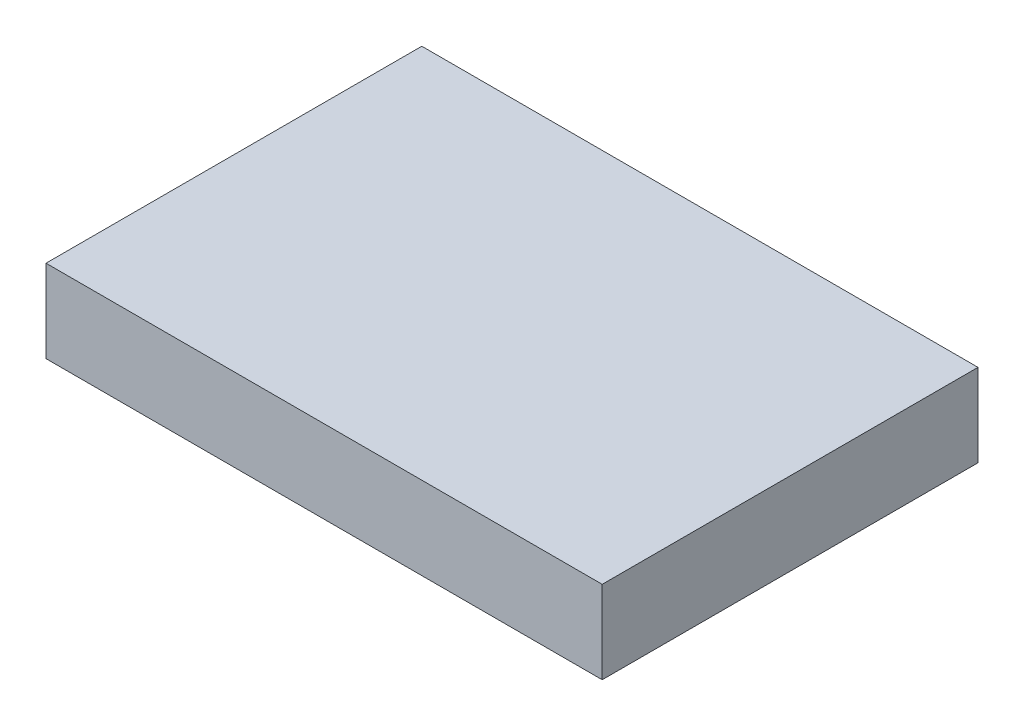
ISO-10303-21;
HEADER;
FILE_DESCRIPTION(('STEP AP214'),'2;1');
FILE_NAME('part.step','',(''),(''),'','','');
FILE_SCHEMA(('AUTOMOTIVE_DESIGN { 1 0 10303 214 1 1 1 1 }'));
ENDSEC;
DATA;
#1=APPLICATION_CONTEXT('core data for automotive mechanical design processes');
#2=APPLICATION_PROTOCOL_DEFINITION('international standard','automotive_design',2000,#1);
#3=PRODUCT_CONTEXT('',#1,'mechanical');
#4=PRODUCT('Part','Part','',(#3));
#5=PRODUCT_RELATED_PRODUCT_CATEGORY('part','',(#4));
#6=PRODUCT_DEFINITION_FORMATION('','',#4);
#7=PRODUCT_DEFINITION_CONTEXT('part definition',#1,'design');
#8=PRODUCT_DEFINITION('design','',#6,#7);
#9=PRODUCT_DEFINITION_SHAPE('','',#8);
#10=(LENGTH_UNIT() NAMED_UNIT(*) SI_UNIT(.MILLI.,.METRE.));
#11=(NAMED_UNIT(*) PLANE_ANGLE_UNIT() SI_UNIT($,.RADIAN.));
#12=(NAMED_UNIT(*) SI_UNIT($,.STERADIAN.) SOLID_ANGLE_UNIT());
#13=UNCERTAINTY_MEASURE_WITH_UNIT(LENGTH_MEASURE(1.E-05),#10,'distance_accuracy_value','');
#14=(GEOMETRIC_REPRESENTATION_CONTEXT(3) GLOBAL_UNCERTAINTY_ASSIGNED_CONTEXT((#13)) GLOBAL_UNIT_ASSIGNED_CONTEXT((#10,
#11,#12)) REPRESENTATION_CONTEXT('',''));
#15=CARTESIAN_POINT('',(0.,0.,0.));
#16=DIRECTION('',(0.,0.,1.));
#17=DIRECTION('',(1.,0.,0.));
#18=AXIS2_PLACEMENT_3D('',#15,#16,#17);
#19=CARTESIAN_POINT('',(18.5,5.5,12.5));
#20=DIRECTION('',(-1.,0.,0.));
#21=DIRECTION('',(0.,0.,1.));
#22=AXIS2_PLACEMENT_3D('',#19,#20,#21);
#23=PLANE('',#22);
#24=DIRECTION('',(0.,0.,-1.));
#25=VECTOR('',#24,1.);
#26=CARTESIAN_POINT('',(18.5,0.,12.5));
#27=LINE('',#26,#25);
#28=CARTESIAN_POINT('',(18.5,0.,12.5));
#29=VERTEX_POINT('',#28);
#30=CARTESIAN_POINT('',(18.5,0.,-12.5));
#31=VERTEX_POINT('',#30);
#32=EDGE_CURVE('E96',#29,#31,#27,.T.);
#33=ORIENTED_EDGE('',*,*,#32,.T.);
#34=DIRECTION('',(0.,-1.,0.));
#35=VECTOR('',#34,1.);
#36=CARTESIAN_POINT('',(18.5,5.5,-12.5));
#37=LINE('',#36,#35);
#38=CARTESIAN_POINT('',(18.5,5.5,-12.5));
#39=VERTEX_POINT('',#38);
#40=EDGE_CURVE('E11',#39,#31,#37,.T.);
#41=ORIENTED_EDGE('',*,*,#40,.F.);
#42=DIRECTION('',(0.,0.,-1.));
#43=VECTOR('',#42,1.);
#44=CARTESIAN_POINT('',(18.5,5.5,12.5));
#45=LINE('',#44,#43);
#46=CARTESIAN_POINT('',(18.5,5.5,12.5));
#47=VERTEX_POINT('',#46);
#48=EDGE_CURVE('E84',#47,#39,#45,.T.);
#49=ORIENTED_EDGE('',*,*,#48,.F.);
#50=DIRECTION('',(0.,-1.,0.));
#51=VECTOR('',#50,1.);
#52=CARTESIAN_POINT('',(18.5,5.5,12.5));
#53=LINE('',#52,#51);
#54=EDGE_CURVE('E92',#47,#29,#53,.T.);
#55=ORIENTED_EDGE('',*,*,#54,.T.);
#56=EDGE_LOOP('',(#33,#41,#49,#55));
#57=FACE_BOUND('',#56,.T.);
#58=ADVANCED_FACE('F33',(#57),#23,.F.);
#59=CARTESIAN_POINT('',(-18.5,5.5,-12.5));
#60=DIRECTION('',(0.,0.,1.));
#61=DIRECTION('',(1.,0.,0.));
#62=AXIS2_PLACEMENT_3D('',#59,#60,#61);
#63=PLANE('',#62);
#64=DIRECTION('',(-1.,0.,0.));
#65=VECTOR('',#64,1.);
#66=CARTESIAN_POINT('',(-18.5,0.,-12.5));
#67=LINE('',#66,#65);
#68=CARTESIAN_POINT('',(-18.5,0.,-12.5));
#69=VERTEX_POINT('',#68);
#70=EDGE_CURVE('E88',#31,#69,#67,.T.);
#71=ORIENTED_EDGE('',*,*,#70,.T.);
#72=DIRECTION('',(0.,-1.,0.));
#73=VECTOR('',#72,1.);
#74=CARTESIAN_POINT('',(-18.5,5.5,-12.5));
#75=LINE('',#74,#73);
#76=CARTESIAN_POINT('',(-18.5,5.5,-12.5));
#77=VERTEX_POINT('',#76);
#78=EDGE_CURVE('E41',#77,#69,#75,.T.);
#79=ORIENTED_EDGE('',*,*,#78,.F.);
#80=DIRECTION('',(-1.,0.,0.));
#81=VECTOR('',#80,1.);
#82=CARTESIAN_POINT('',(-18.5,5.5,-12.5));
#83=LINE('',#82,#81);
#84=EDGE_CURVE('E79',#39,#77,#83,.T.);
#85=ORIENTED_EDGE('',*,*,#84,.F.);
#86=ORIENTED_EDGE('',*,*,#40,.T.);
#87=EDGE_LOOP('',(#71,#79,#85,#86));
#88=FACE_BOUND('',#87,.T.);
#89=ADVANCED_FACE('F87',(#88),#63,.F.);
#90=CARTESIAN_POINT('',(-18.5,5.5,12.5));
#91=DIRECTION('',(1.,0.,0.));
#92=DIRECTION('',(0.,0.,-1.));
#93=AXIS2_PLACEMENT_3D('',#90,#91,#92);
#94=PLANE('',#93);
#95=DIRECTION('',(0.,0.,1.));
#96=VECTOR('',#95,1.);
#97=CARTESIAN_POINT('',(-18.5,0.,12.5));
#98=LINE('',#97,#96);
#99=CARTESIAN_POINT('',(-18.5,0.,12.5));
#100=VERTEX_POINT('',#99);
#101=EDGE_CURVE('E66',#69,#100,#98,.T.);
#102=ORIENTED_EDGE('',*,*,#101,.T.);
#103=DIRECTION('',(0.,-1.,0.));
#104=VECTOR('',#103,1.);
#105=CARTESIAN_POINT('',(-18.5,5.5,12.5));
#106=LINE('',#105,#104);
#107=CARTESIAN_POINT('',(-18.5,5.5,12.5));
#108=VERTEX_POINT('',#107);
#109=EDGE_CURVE('E89',#108,#100,#106,.T.);
#110=ORIENTED_EDGE('',*,*,#109,.F.);
#111=DIRECTION('',(0.,0.,1.));
#112=VECTOR('',#111,1.);
#113=CARTESIAN_POINT('',(-18.5,5.5,12.5));
#114=LINE('',#113,#112);
#115=EDGE_CURVE('E82',#77,#108,#114,.T.);
#116=ORIENTED_EDGE('',*,*,#115,.F.);
#117=ORIENTED_EDGE('',*,*,#78,.T.);
#118=EDGE_LOOP('',(#102,#110,#116,#117));
#119=FACE_BOUND('',#118,.T.);
#120=ADVANCED_FACE('F90',(#119),#94,.F.);
#121=CARTESIAN_POINT('',(-18.5,5.5,12.5));
#122=DIRECTION('',(0.,0.,-1.));
#123=DIRECTION('',(-1.,0.,0.));
#124=AXIS2_PLACEMENT_3D('',#121,#122,#123);
#125=PLANE('',#124);
#126=DIRECTION('',(1.,0.,0.));
#127=VECTOR('',#126,1.);
#128=CARTESIAN_POINT('',(-18.5,0.,12.5));
#129=LINE('',#128,#127);
#130=EDGE_CURVE('E72',#100,#29,#129,.T.);
#131=ORIENTED_EDGE('',*,*,#130,.T.);
#132=ORIENTED_EDGE('',*,*,#54,.F.);
#133=DIRECTION('',(1.,0.,0.));
#134=VECTOR('',#133,1.);
#135=CARTESIAN_POINT('',(-18.5,5.5,12.5));
#136=LINE('',#135,#134);
#137=EDGE_CURVE('E49',#108,#47,#136,.T.);
#138=ORIENTED_EDGE('',*,*,#137,.F.);
#139=ORIENTED_EDGE('',*,*,#109,.T.);
#140=EDGE_LOOP('',(#131,#132,#138,#139));
#141=FACE_BOUND('',#140,.T.);
#142=ADVANCED_FACE('F103',(#141),#125,.F.);
#143=CARTESIAN_POINT('',(0.,5.5,0.));
#144=DIRECTION('',(0.,-1.,0.));
#145=DIRECTION('',(0.,0.,-1.));
#146=AXIS2_PLACEMENT_3D('',#143,#144,#145);
#147=PLANE('',#146);
#148=ORIENTED_EDGE('',*,*,#48,.T.);
#149=ORIENTED_EDGE('',*,*,#84,.T.);
#150=ORIENTED_EDGE('',*,*,#115,.T.);
#151=ORIENTED_EDGE('',*,*,#137,.T.);
#152=EDGE_LOOP('',(#148,#149,#150,#151));
#153=FACE_BOUND('',#152,.T.);
#154=ADVANCED_FACE('F80',(#153),#147,.F.);
#155=CARTESIAN_POINT('',(0.,0.,0.));
#156=DIRECTION('',(0.,-1.,0.));
#157=DIRECTION('',(0.,0.,-1.));
#158=AXIS2_PLACEMENT_3D('',#155,#156,#157);
#159=PLANE('',#158);
#160=ORIENTED_EDGE('',*,*,#32,.F.);
#161=ORIENTED_EDGE('',*,*,#130,.F.);
#162=ORIENTED_EDGE('',*,*,#101,.F.);
#163=ORIENTED_EDGE('',*,*,#70,.F.);
#164=EDGE_LOOP('',(#160,#161,#162,#163));
#165=FACE_BOUND('',#164,.T.);
#166=ADVANCED_FACE('F106',(#165),#159,.T.);
#167=CLOSED_SHELL('',(#58,#89,#120,#142,#154,#166));
#168=MANIFOLD_SOLID_BREP('B2',#167);
#169=ADVANCED_BREP_SHAPE_REPRESENTATION('',(#18,#168),#14);
#170=SHAPE_DEFINITION_REPRESENTATION(#9,#169);
ENDSEC;
END-ISO-10303-21;
